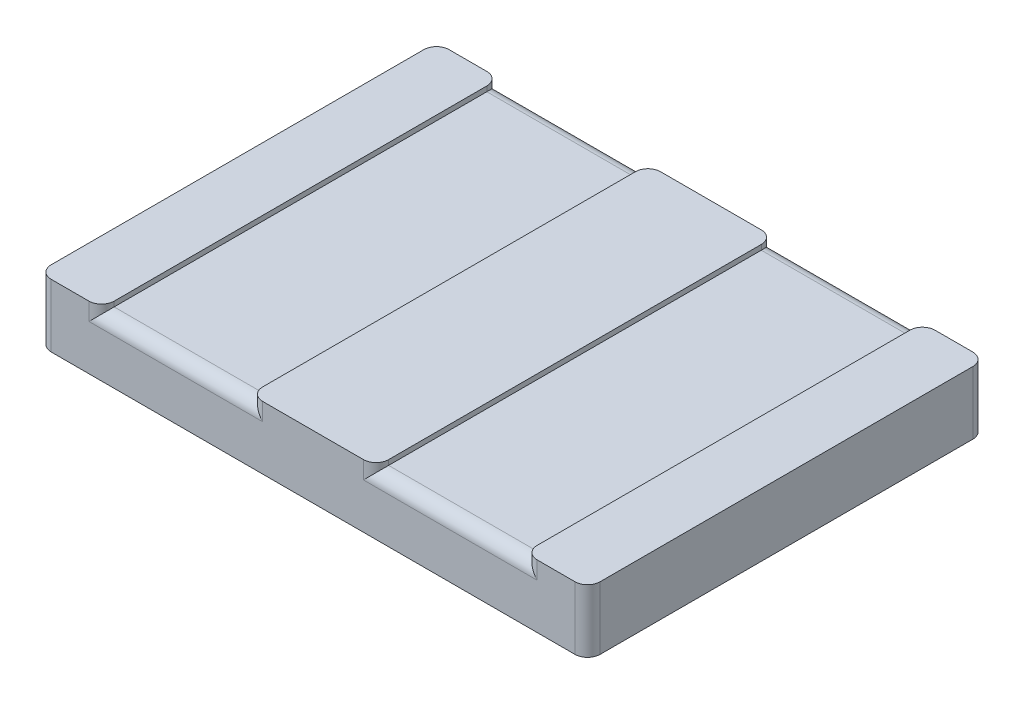
ISO-10303-21;
HEADER;
FILE_DESCRIPTION(('STEP AP214'),'2;1');
FILE_NAME('part.step','',(''),(''),'','','');
FILE_SCHEMA(('AUTOMOTIVE_DESIGN { 1 0 10303 214 1 1 1 1 }'));
ENDSEC;
DATA;
#1=APPLICATION_CONTEXT('core data for automotive mechanical design processes');
#2=APPLICATION_PROTOCOL_DEFINITION('international standard','automotive_design',2000,#1);
#3=PRODUCT_CONTEXT('',#1,'mechanical');
#4=PRODUCT('Part','Part','',(#3));
#5=PRODUCT_RELATED_PRODUCT_CATEGORY('part','',(#4));
#6=PRODUCT_DEFINITION_FORMATION('','',#4);
#7=PRODUCT_DEFINITION_CONTEXT('part definition',#1,'design');
#8=PRODUCT_DEFINITION('design','',#6,#7);
#9=PRODUCT_DEFINITION_SHAPE('','',#8);
#10=(LENGTH_UNIT() NAMED_UNIT(*) SI_UNIT(.MILLI.,.METRE.));
#11=(NAMED_UNIT(*) PLANE_ANGLE_UNIT() SI_UNIT($,.RADIAN.));
#12=(NAMED_UNIT(*) SI_UNIT($,.STERADIAN.) SOLID_ANGLE_UNIT());
#13=UNCERTAINTY_MEASURE_WITH_UNIT(LENGTH_MEASURE(1.E-05),#10,'distance_accuracy_value','');
#14=(GEOMETRIC_REPRESENTATION_CONTEXT(3) GLOBAL_UNCERTAINTY_ASSIGNED_CONTEXT((#13)) GLOBAL_UNIT_ASSIGNED_CONTEXT((#10,
#11,#12)) REPRESENTATION_CONTEXT('',''));
#15=CARTESIAN_POINT('',(0.,0.,0.));
#16=DIRECTION('',(0.,0.,1.));
#17=DIRECTION('',(1.,0.,0.));
#18=AXIS2_PLACEMENT_3D('',#15,#16,#17);
#19=CARTESIAN_POINT('',(10.9,0.,-7.9));
#20=DIRECTION('',(1.,0.,0.));
#21=DIRECTION('',(0.,0.,-1.));
#22=AXIS2_PLACEMENT_3D('',#19,#20,#21);
#23=PLANE('',#22);
#24=DIRECTION('',(0.,0.,1.));
#25=VECTOR('',#24,1.);
#26=CARTESIAN_POINT('',(10.9,0.,-7.9));
#27=LINE('',#26,#25);
#28=CARTESIAN_POINT('',(10.9,0.,-7.4));
#29=VERTEX_POINT('',#28);
#30=CARTESIAN_POINT('',(10.9,0.,7.4));
#31=VERTEX_POINT('',#30);
#32=EDGE_CURVE('E282',#29,#31,#27,.T.);
#33=ORIENTED_EDGE('',*,*,#32,.F.);
#34=DIRECTION('',(0.,1.,0.));
#35=VECTOR('',#34,1.);
#36=CARTESIAN_POINT('',(10.9,2.5,-7.4));
#37=LINE('',#36,#35);
#38=CARTESIAN_POINT('',(10.9,2.5,-7.4));
#39=VERTEX_POINT('',#38);
#40=EDGE_CURVE('E389',#29,#39,#37,.T.);
#41=ORIENTED_EDGE('',*,*,#40,.T.);
#42=DIRECTION('',(0.,0.,1.));
#43=VECTOR('',#42,1.);
#44=CARTESIAN_POINT('',(10.9,2.5,-7.9));
#45=LINE('',#44,#43);
#46=CARTESIAN_POINT('',(10.9,2.5,7.4));
#47=VERTEX_POINT('',#46);
#48=EDGE_CURVE('E276',#39,#47,#45,.T.);
#49=ORIENTED_EDGE('',*,*,#48,.T.);
#50=DIRECTION('',(0.,1.,0.));
#51=VECTOR('',#50,1.);
#52=CARTESIAN_POINT('',(10.9,0.,7.4));
#53=LINE('',#52,#51);
#54=EDGE_CURVE('E386',#47,#31,#53,.F.);
#55=ORIENTED_EDGE('',*,*,#54,.T.);
#56=EDGE_LOOP('',(#33,#41,#49,#55));
#57=FACE_BOUND('',#56,.T.);
#58=ADVANCED_FACE('F39',(#57),#23,.T.);
#59=CARTESIAN_POINT('',(-10.9,0.,-7.9));
#60=DIRECTION('',(0.,-1.,0.));
#61=DIRECTION('',(0.,0.,-1.));
#62=AXIS2_PLACEMENT_3D('',#59,#60,#61);
#63=PLANE('',#62);
#64=DIRECTION('',(0.,0.,1.));
#65=VECTOR('',#64,1.);
#66=CARTESIAN_POINT('',(-10.9,0.,-7.9));
#67=LINE('',#66,#65);
#68=CARTESIAN_POINT('',(-10.9,0.,-7.4));
#69=VERTEX_POINT('',#68);
#70=CARTESIAN_POINT('',(-10.9,0.,7.4));
#71=VERTEX_POINT('',#70);
#72=EDGE_CURVE('E484',#69,#71,#67,.T.);
#73=ORIENTED_EDGE('',*,*,#72,.F.);
#74=CARTESIAN_POINT('',(-10.4,0.,-7.4));
#75=DIRECTION('',(0.,-1.,0.));
#76=DIRECTION('',(0.,0.,-1.));
#77=AXIS2_PLACEMENT_3D('',#74,#75,#76);
#78=CIRCLE('',#77,0.5);
#79=CARTESIAN_POINT('',(-10.4,0.,-7.9));
#80=VERTEX_POINT('',#79);
#81=EDGE_CURVE('E352',#69,#80,#78,.T.);
#82=ORIENTED_EDGE('',*,*,#81,.T.);
#83=DIRECTION('',(1.,0.,0.));
#84=VECTOR('',#83,1.);
#85=CARTESIAN_POINT('',(-10.9,0.,-7.9));
#86=LINE('',#85,#84);
#87=CARTESIAN_POINT('',(10.4,0.,-7.9));
#88=VERTEX_POINT('',#87);
#89=EDGE_CURVE('E280',#80,#88,#86,.T.);
#90=ORIENTED_EDGE('',*,*,#89,.T.);
#91=CARTESIAN_POINT('',(10.4,0.,-7.4));
#92=DIRECTION('',(0.,-1.,0.));
#93=DIRECTION('',(0.,0.,-1.));
#94=AXIS2_PLACEMENT_3D('',#91,#92,#93);
#95=CIRCLE('',#94,0.5);
#96=EDGE_CURVE('E349',#88,#29,#95,.T.);
#97=ORIENTED_EDGE('',*,*,#96,.T.);
#98=ORIENTED_EDGE('',*,*,#32,.T.);
#99=CARTESIAN_POINT('',(10.4,0.,7.4));
#100=DIRECTION('',(0.,-1.,0.));
#101=DIRECTION('',(0.,0.,-1.));
#102=AXIS2_PLACEMENT_3D('',#99,#100,#101);
#103=CIRCLE('',#102,0.5);
#104=CARTESIAN_POINT('',(10.4,0.,7.9));
#105=VERTEX_POINT('',#104);
#106=EDGE_CURVE('E346',#31,#105,#103,.T.);
#107=ORIENTED_EDGE('',*,*,#106,.T.);
#108=DIRECTION('',(1.,0.,0.));
#109=VECTOR('',#108,1.);
#110=CARTESIAN_POINT('',(-10.9,0.,7.9));
#111=LINE('',#110,#109);
#112=CARTESIAN_POINT('',(-10.4,0.,7.9));
#113=VERTEX_POINT('',#112);
#114=EDGE_CURVE('E456',#113,#105,#111,.T.);
#115=ORIENTED_EDGE('',*,*,#114,.F.);
#116=CARTESIAN_POINT('',(-10.4,0.,7.4));
#117=DIRECTION('',(0.,-1.,0.));
#118=DIRECTION('',(0.,0.,-1.));
#119=AXIS2_PLACEMENT_3D('',#116,#117,#118);
#120=CIRCLE('',#119,0.5);
#121=EDGE_CURVE('E343',#113,#71,#120,.T.);
#122=ORIENTED_EDGE('',*,*,#121,.T.);
#123=EDGE_LOOP('',(#73,#82,#90,#97,#98,#107,#115,#122));
#124=FACE_BOUND('',#123,.T.);
#125=ADVANCED_FACE('F498',(#124),#63,.T.);
#126=CARTESIAN_POINT('',(-10.9,0.,-7.9));
#127=DIRECTION('',(-1.,0.,0.));
#128=DIRECTION('',(0.,0.,1.));
#129=AXIS2_PLACEMENT_3D('',#126,#127,#128);
#130=PLANE('',#129);
#131=DIRECTION('',(0.,0.,1.));
#132=VECTOR('',#131,1.);
#133=CARTESIAN_POINT('',(-10.9,2.5,-7.9));
#134=LINE('',#133,#132);
#135=CARTESIAN_POINT('',(-10.9,2.5,-7.4));
#136=VERTEX_POINT('',#135);
#137=CARTESIAN_POINT('',(-10.9,2.5,7.4));
#138=VERTEX_POINT('',#137);
#139=EDGE_CURVE('E251',#136,#138,#134,.T.);
#140=ORIENTED_EDGE('',*,*,#139,.F.);
#141=DIRECTION('',(0.,-1.,0.));
#142=VECTOR('',#141,1.);
#143=CARTESIAN_POINT('',(-10.9,0.,-7.4));
#144=LINE('',#143,#142);
#145=EDGE_CURVE('E339',#136,#69,#144,.T.);
#146=ORIENTED_EDGE('',*,*,#145,.T.);
#147=ORIENTED_EDGE('',*,*,#72,.T.);
#148=DIRECTION('',(0.,-1.,0.));
#149=VECTOR('',#148,1.);
#150=CARTESIAN_POINT('',(-10.9,0.,7.4));
#151=LINE('',#150,#149);
#152=EDGE_CURVE('E336',#71,#138,#151,.F.);
#153=ORIENTED_EDGE('',*,*,#152,.T.);
#154=EDGE_LOOP('',(#140,#146,#147,#153));
#155=FACE_BOUND('',#154,.T.);
#156=ADVANCED_FACE('F576',(#155),#130,.T.);
#157=CARTESIAN_POINT('',(-10.9,2.5,-7.9));
#158=DIRECTION('',(0.,1.,0.));
#159=DIRECTION('',(-1.,0.,0.));
#160=AXIS2_PLACEMENT_3D('',#157,#158,#159);
#161=PLANE('',#160);
#162=DIRECTION('',(0.,0.,1.));
#163=VECTOR('',#162,1.);
#164=CARTESIAN_POINT('',(-8.4,2.5,-7.9));
#165=LINE('',#164,#163);
#166=CARTESIAN_POINT('',(-8.4,2.5,-7.4));
#167=VERTEX_POINT('',#166);
#168=CARTESIAN_POINT('',(-8.4,2.5,7.4));
#169=VERTEX_POINT('',#168);
#170=EDGE_CURVE('E247',#167,#169,#165,.T.);
#171=ORIENTED_EDGE('',*,*,#170,.F.);
#172=CARTESIAN_POINT('',(-8.9,2.5,-7.4));
#173=DIRECTION('',(0.,1.,0.));
#174=DIRECTION('',(-1.,0.,0.));
#175=AXIS2_PLACEMENT_3D('',#172,#173,#174);
#176=CIRCLE('',#175,0.5);
#177=CARTESIAN_POINT('',(-8.9,2.5,-7.9));
#178=VERTEX_POINT('',#177);
#179=EDGE_CURVE('E222',#167,#178,#176,.T.);
#180=ORIENTED_EDGE('',*,*,#179,.T.);
#181=DIRECTION('',(-1.,0.,0.));
#182=VECTOR('',#181,1.);
#183=CARTESIAN_POINT('',(-10.9,2.5,-7.9));
#184=LINE('',#183,#182);
#185=CARTESIAN_POINT('',(-10.4,2.5,-7.9));
#186=VERTEX_POINT('',#185);
#187=EDGE_CURVE('E474',#178,#186,#184,.T.);
#188=ORIENTED_EDGE('',*,*,#187,.T.);
#189=CARTESIAN_POINT('',(-10.4,2.5,-7.4));
#190=DIRECTION('',(0.,1.,0.));
#191=DIRECTION('',(-1.,0.,0.));
#192=AXIS2_PLACEMENT_3D('',#189,#190,#191);
#193=CIRCLE('',#192,0.5);
#194=EDGE_CURVE('E331',#186,#136,#193,.T.);
#195=ORIENTED_EDGE('',*,*,#194,.T.);
#196=ORIENTED_EDGE('',*,*,#139,.T.);
#197=CARTESIAN_POINT('',(-10.4,2.5,7.4));
#198=DIRECTION('',(0.,1.,0.));
#199=DIRECTION('',(-1.,0.,0.));
#200=AXIS2_PLACEMENT_3D('',#197,#198,#199);
#201=CIRCLE('',#200,0.5);
#202=CARTESIAN_POINT('',(-10.4,2.5,7.9));
#203=VERTEX_POINT('',#202);
#204=EDGE_CURVE('E228',#138,#203,#201,.T.);
#205=ORIENTED_EDGE('',*,*,#204,.T.);
#206=DIRECTION('',(-1.,0.,0.));
#207=VECTOR('',#206,1.);
#208=CARTESIAN_POINT('',(-10.9,2.5,7.9));
#209=LINE('',#208,#207);
#210=CARTESIAN_POINT('',(-8.9,2.5,7.9));
#211=VERTEX_POINT('',#210);
#212=EDGE_CURVE('E449',#211,#203,#209,.T.);
#213=ORIENTED_EDGE('',*,*,#212,.F.);
#214=CARTESIAN_POINT('',(-8.9,2.5,7.4));
#215=DIRECTION('',(0.,1.,0.));
#216=DIRECTION('',(-1.,0.,0.));
#217=AXIS2_PLACEMENT_3D('',#214,#215,#216);
#218=CIRCLE('',#217,0.5);
#219=EDGE_CURVE('E328',#211,#169,#218,.T.);
#220=ORIENTED_EDGE('',*,*,#219,.T.);
#221=EDGE_LOOP('',(#171,#180,#188,#195,#196,#205,#213,#220));
#222=FACE_BOUND('',#221,.T.);
#223=ADVANCED_FACE('F452',(#222),#161,.T.);
#224=CARTESIAN_POINT('',(-8.4,2.5,-7.9));
#225=DIRECTION('',(1.,0.,0.));
#226=DIRECTION('',(0.,0.,-1.));
#227=AXIS2_PLACEMENT_3D('',#224,#225,#226);
#228=PLANE('',#227);
#229=DIRECTION('',(0.,0.,1.));
#230=VECTOR('',#229,1.);
#231=CARTESIAN_POINT('',(-8.4,2.29999999999999,-7.9));
#232=LINE('',#231,#230);
#233=CARTESIAN_POINT('',(-8.4,2.29999999999999,-7.4));
#234=VERTEX_POINT('',#233);
#235=CARTESIAN_POINT('',(-8.4,2.29999999999999,7.4));
#236=VERTEX_POINT('',#235);
#237=EDGE_CURVE('E235',#234,#236,#232,.T.);
#238=ORIENTED_EDGE('',*,*,#237,.F.);
#239=DIRECTION('',(0.,1.,0.));
#240=VECTOR('',#239,1.);
#241=CARTESIAN_POINT('',(-8.4,2.5,-7.4));
#242=LINE('',#241,#240);
#243=EDGE_CURVE('E220',#234,#167,#242,.T.);
#244=ORIENTED_EDGE('',*,*,#243,.T.);
#245=ORIENTED_EDGE('',*,*,#170,.T.);
#246=DIRECTION('',(0.,1.,0.));
#247=VECTOR('',#246,1.);
#248=CARTESIAN_POINT('',(-8.4,2.5,7.4));
#249=LINE('',#248,#247);
#250=EDGE_CURVE('E229',#169,#236,#249,.F.);
#251=ORIENTED_EDGE('',*,*,#250,.T.);
#252=EDGE_LOOP('',(#238,#244,#245,#251));
#253=FACE_BOUND('',#252,.T.);
#254=ADVANCED_FACE('F244',(#253),#228,.T.);
#255=CARTESIAN_POINT('',(-8.4,2.29999999999999,-7.9));
#256=DIRECTION('',(0.,1.,0.));
#257=DIRECTION('',(-1.,0.,0.));
#258=AXIS2_PLACEMENT_3D('',#255,#256,#257);
#259=PLANE('',#258);
#260=DIRECTION('',(0.,0.,1.));
#261=VECTOR('',#260,1.);
#262=CARTESIAN_POINT('',(-2.5,2.3,-7.9));
#263=LINE('',#262,#261);
#264=CARTESIAN_POINT('',(-2.5,2.3,-7.4));
#265=VERTEX_POINT('',#264);
#266=CARTESIAN_POINT('',(-2.5,2.3,7.4));
#267=VERTEX_POINT('',#266);
#268=EDGE_CURVE('E238',#265,#267,#263,.T.);
#269=ORIENTED_EDGE('',*,*,#268,.F.);
#270=DIRECTION('',(-1.,0.,0.));
#271=VECTOR('',#270,1.);
#272=CARTESIAN_POINT('',(-8.4,2.29999999999999,-7.4));
#273=LINE('',#272,#271);
#274=EDGE_CURVE('E211',#265,#234,#273,.T.);
#275=ORIENTED_EDGE('',*,*,#274,.T.);
#276=ORIENTED_EDGE('',*,*,#237,.T.);
#277=DIRECTION('',(-1.,0.,0.));
#278=VECTOR('',#277,1.);
#279=CARTESIAN_POINT('',(-8.4,2.29999999999999,7.4));
#280=LINE('',#279,#278);
#281=EDGE_CURVE('E242',#236,#267,#280,.F.);
#282=ORIENTED_EDGE('',*,*,#281,.T.);
#283=EDGE_LOOP('',(#269,#275,#276,#282));
#284=FACE_BOUND('',#283,.T.);
#285=ADVANCED_FACE('F234',(#284),#259,.T.);
#286=CARTESIAN_POINT('',(-2.5,2.3,-7.9));
#287=DIRECTION('',(-1.,0.,0.));
#288=DIRECTION('',(0.,0.,1.));
#289=AXIS2_PLACEMENT_3D('',#286,#287,#288);
#290=PLANE('',#289);
#291=DIRECTION('',(0.,0.,1.));
#292=VECTOR('',#291,1.);
#293=CARTESIAN_POINT('',(-2.5,2.5,-7.9));
#294=LINE('',#293,#292);
#295=CARTESIAN_POINT('',(-2.5,2.5,-7.4));
#296=VERTEX_POINT('',#295);
#297=CARTESIAN_POINT('',(-2.5,2.5,7.4));
#298=VERTEX_POINT('',#297);
#299=EDGE_CURVE('E253',#296,#298,#294,.T.);
#300=ORIENTED_EDGE('',*,*,#299,.F.);
#301=DIRECTION('',(0.,-1.,0.));
#302=VECTOR('',#301,1.);
#303=CARTESIAN_POINT('',(-2.5,2.3,-7.4));
#304=LINE('',#303,#302);
#305=EDGE_CURVE('E309',#296,#265,#304,.T.);
#306=ORIENTED_EDGE('',*,*,#305,.T.);
#307=ORIENTED_EDGE('',*,*,#268,.T.);
#308=DIRECTION('',(0.,-1.,0.));
#309=VECTOR('',#308,1.);
#310=CARTESIAN_POINT('',(-2.5,2.3,7.4));
#311=LINE('',#310,#309);
#312=EDGE_CURVE('E306',#267,#298,#311,.F.);
#313=ORIENTED_EDGE('',*,*,#312,.T.);
#314=EDGE_LOOP('',(#300,#306,#307,#313));
#315=FACE_BOUND('',#314,.T.);
#316=ADVANCED_FACE('F530',(#315),#290,.T.);
#317=CARTESIAN_POINT('',(2.5,2.5,-7.9));
#318=DIRECTION('',(0.,1.,0.));
#319=DIRECTION('',(-1.,0.,0.));
#320=AXIS2_PLACEMENT_3D('',#317,#318,#319);
#321=PLANE('',#320);
#322=DIRECTION('',(-1.,0.,0.));
#323=VECTOR('',#322,1.);
#324=CARTESIAN_POINT('',(2.5,2.5,-7.9));
#325=LINE('',#324,#323);
#326=CARTESIAN_POINT('',(2.,2.5,-7.9));
#327=VERTEX_POINT('',#326);
#328=CARTESIAN_POINT('',(-2.,2.5,-7.9));
#329=VERTEX_POINT('',#328);
#330=EDGE_CURVE('E470',#327,#329,#325,.T.);
#331=ORIENTED_EDGE('',*,*,#330,.T.);
#332=CARTESIAN_POINT('',(-2.,2.5,-7.4));
#333=DIRECTION('',(0.,1.,0.));
#334=DIRECTION('',(-1.,0.,0.));
#335=AXIS2_PLACEMENT_3D('',#332,#333,#334);
#336=CIRCLE('',#335,0.5);
#337=EDGE_CURVE('E321',#329,#296,#336,.T.);
#338=ORIENTED_EDGE('',*,*,#337,.T.);
#339=ORIENTED_EDGE('',*,*,#299,.T.);
#340=CARTESIAN_POINT('',(-2.,2.5,7.4));
#341=DIRECTION('',(0.,1.,0.));
#342=DIRECTION('',(-1.,0.,0.));
#343=AXIS2_PLACEMENT_3D('',#340,#341,#342);
#344=CIRCLE('',#343,0.5);
#345=CARTESIAN_POINT('',(-2.,2.5,7.9));
#346=VERTEX_POINT('',#345);
#347=EDGE_CURVE('E312',#298,#346,#344,.T.);
#348=ORIENTED_EDGE('',*,*,#347,.T.);
#349=DIRECTION('',(-1.,0.,0.));
#350=VECTOR('',#349,1.);
#351=CARTESIAN_POINT('',(2.5,2.5,7.9));
#352=LINE('',#351,#350);
#353=CARTESIAN_POINT('',(2.,2.5,7.9));
#354=VERTEX_POINT('',#353);
#355=EDGE_CURVE('E457',#354,#346,#352,.T.);
#356=ORIENTED_EDGE('',*,*,#355,.F.);
#357=CARTESIAN_POINT('',(2.,2.5,7.4));
#358=DIRECTION('',(0.,1.,0.));
#359=DIRECTION('',(-1.,0.,0.));
#360=AXIS2_PLACEMENT_3D('',#357,#358,#359);
#361=CIRCLE('',#360,0.5);
#362=CARTESIAN_POINT('',(2.5,2.5,7.4));
#363=VERTEX_POINT('',#362);
#364=EDGE_CURVE('E315',#354,#363,#361,.T.);
#365=ORIENTED_EDGE('',*,*,#364,.T.);
#366=DIRECTION('',(0.,0.,1.));
#367=VECTOR('',#366,1.);
#368=CARTESIAN_POINT('',(2.5,2.5,-7.9));
#369=LINE('',#368,#367);
#370=CARTESIAN_POINT('',(2.5,2.5,-7.4));
#371=VERTEX_POINT('',#370);
#372=EDGE_CURVE('E260',#371,#363,#369,.T.);
#373=ORIENTED_EDGE('',*,*,#372,.F.);
#374=CARTESIAN_POINT('',(2.,2.5,-7.4));
#375=DIRECTION('',(0.,1.,0.));
#376=DIRECTION('',(-1.,0.,0.));
#377=AXIS2_PLACEMENT_3D('',#374,#375,#376);
#378=CIRCLE('',#377,0.5);
#379=EDGE_CURVE('E318',#371,#327,#378,.T.);
#380=ORIENTED_EDGE('',*,*,#379,.T.);
#381=EDGE_LOOP('',(#331,#338,#339,#348,#356,#365,#373,#380));
#382=FACE_BOUND('',#381,.T.);
#383=ADVANCED_FACE('F524',(#382),#321,.T.);
#384=CARTESIAN_POINT('',(2.5,2.3,-7.9));
#385=DIRECTION('',(1.,0.,0.));
#386=DIRECTION('',(0.,0.,-1.));
#387=AXIS2_PLACEMENT_3D('',#384,#385,#386);
#388=PLANE('',#387);
#389=DIRECTION('',(0.,0.,1.));
#390=VECTOR('',#389,1.);
#391=CARTESIAN_POINT('',(2.5,2.3,-7.9));
#392=LINE('',#391,#390);
#393=CARTESIAN_POINT('',(2.5,2.3,-7.4));
#394=VERTEX_POINT('',#393);
#395=CARTESIAN_POINT('',(2.5,2.3,7.4));
#396=VERTEX_POINT('',#395);
#397=EDGE_CURVE('E264',#394,#396,#392,.T.);
#398=ORIENTED_EDGE('',*,*,#397,.F.);
#399=DIRECTION('',(0.,1.,0.));
#400=VECTOR('',#399,1.);
#401=CARTESIAN_POINT('',(2.5,2.5,-7.4));
#402=LINE('',#401,#400);
#403=EDGE_CURVE('E358',#394,#371,#402,.T.);
#404=ORIENTED_EDGE('',*,*,#403,.T.);
#405=ORIENTED_EDGE('',*,*,#372,.T.);
#406=DIRECTION('',(0.,1.,0.));
#407=VECTOR('',#406,1.);
#408=CARTESIAN_POINT('',(2.5,2.3,7.4));
#409=LINE('',#408,#407);
#410=EDGE_CURVE('E355',#363,#396,#409,.F.);
#411=ORIENTED_EDGE('',*,*,#410,.T.);
#412=EDGE_LOOP('',(#398,#404,#405,#411));
#413=FACE_BOUND('',#412,.T.);
#414=ADVANCED_FACE('F545',(#413),#388,.T.);
#415=CARTESIAN_POINT('',(8.4,2.3,-7.9));
#416=DIRECTION('',(0.,1.,0.));
#417=DIRECTION('',(-1.,0.,0.));
#418=AXIS2_PLACEMENT_3D('',#415,#416,#417);
#419=PLANE('',#418);
#420=DIRECTION('',(0.,0.,1.));
#421=VECTOR('',#420,1.);
#422=CARTESIAN_POINT('',(8.4,2.3,-7.9));
#423=LINE('',#422,#421);
#424=CARTESIAN_POINT('',(8.4,2.3,-7.4));
#425=VERTEX_POINT('',#424);
#426=CARTESIAN_POINT('',(8.4,2.3,7.4));
#427=VERTEX_POINT('',#426);
#428=EDGE_CURVE('E268',#425,#427,#423,.T.);
#429=ORIENTED_EDGE('',*,*,#428,.F.);
#430=DIRECTION('',(-1.,0.,0.));
#431=VECTOR('',#430,1.);
#432=CARTESIAN_POINT('',(2.5,2.3,-7.4));
#433=LINE('',#432,#431);
#434=EDGE_CURVE('E365',#425,#394,#433,.T.);
#435=ORIENTED_EDGE('',*,*,#434,.T.);
#436=ORIENTED_EDGE('',*,*,#397,.T.);
#437=DIRECTION('',(-1.,0.,0.));
#438=VECTOR('',#437,1.);
#439=CARTESIAN_POINT('',(8.4,2.3,7.4));
#440=LINE('',#439,#438);
#441=EDGE_CURVE('E362',#396,#427,#440,.F.);
#442=ORIENTED_EDGE('',*,*,#441,.T.);
#443=EDGE_LOOP('',(#429,#435,#436,#442));
#444=FACE_BOUND('',#443,.T.);
#445=ADVANCED_FACE('F561',(#444),#419,.T.);
#446=CARTESIAN_POINT('',(8.4,2.5,-7.9));
#447=DIRECTION('',(-1.,0.,0.));
#448=DIRECTION('',(0.,0.,1.));
#449=AXIS2_PLACEMENT_3D('',#446,#447,#448);
#450=PLANE('',#449);
#451=DIRECTION('',(0.,0.,1.));
#452=VECTOR('',#451,1.);
#453=CARTESIAN_POINT('',(8.4,2.5,-7.9));
#454=LINE('',#453,#452);
#455=CARTESIAN_POINT('',(8.4,2.5,-7.4));
#456=VERTEX_POINT('',#455);
#457=CARTESIAN_POINT('',(8.4,2.5,7.4));
#458=VERTEX_POINT('',#457);
#459=EDGE_CURVE('E272',#456,#458,#454,.T.);
#460=ORIENTED_EDGE('',*,*,#459,.F.);
#461=DIRECTION('',(0.,-1.,0.));
#462=VECTOR('',#461,1.);
#463=CARTESIAN_POINT('',(8.4,2.3,-7.4));
#464=LINE('',#463,#462);
#465=EDGE_CURVE('E371',#456,#425,#464,.T.);
#466=ORIENTED_EDGE('',*,*,#465,.T.);
#467=ORIENTED_EDGE('',*,*,#428,.T.);
#468=DIRECTION('',(0.,-1.,0.));
#469=VECTOR('',#468,1.);
#470=CARTESIAN_POINT('',(8.4,2.5,7.4));
#471=LINE('',#470,#469);
#472=EDGE_CURVE('E368',#427,#458,#471,.F.);
#473=ORIENTED_EDGE('',*,*,#472,.T.);
#474=EDGE_LOOP('',(#460,#466,#467,#473));
#475=FACE_BOUND('',#474,.T.);
#476=ADVANCED_FACE('F559',(#475),#450,.T.);
#477=CARTESIAN_POINT('',(10.9,2.5,-7.9));
#478=DIRECTION('',(0.,1.,0.));
#479=DIRECTION('',(-1.,0.,0.));
#480=AXIS2_PLACEMENT_3D('',#477,#478,#479);
#481=PLANE('',#480);
#482=DIRECTION('',(-1.,0.,0.));
#483=VECTOR('',#482,1.);
#484=CARTESIAN_POINT('',(10.9,2.5,-7.9));
#485=LINE('',#484,#483);
#486=CARTESIAN_POINT('',(10.4,2.5,-7.9));
#487=VERTEX_POINT('',#486);
#488=CARTESIAN_POINT('',(8.90000000000001,2.5,-7.9));
#489=VERTEX_POINT('',#488);
#490=EDGE_CURVE('E461',#487,#489,#485,.T.);
#491=ORIENTED_EDGE('',*,*,#490,.T.);
#492=CARTESIAN_POINT('',(8.9,2.5,-7.4));
#493=DIRECTION('',(0.,1.,0.));
#494=DIRECTION('',(-1.,0.,0.));
#495=AXIS2_PLACEMENT_3D('',#492,#493,#494);
#496=CIRCLE('',#495,0.5);
#497=EDGE_CURVE('E383',#489,#456,#496,.T.);
#498=ORIENTED_EDGE('',*,*,#497,.T.);
#499=ORIENTED_EDGE('',*,*,#459,.T.);
#500=CARTESIAN_POINT('',(8.9,2.5,7.4));
#501=DIRECTION('',(0.,1.,0.));
#502=DIRECTION('',(-1.,0.,0.));
#503=AXIS2_PLACEMENT_3D('',#500,#501,#502);
#504=CIRCLE('',#503,0.5);
#505=CARTESIAN_POINT('',(8.90000000000001,2.5,7.9));
#506=VERTEX_POINT('',#505);
#507=EDGE_CURVE('E374',#458,#506,#504,.T.);
#508=ORIENTED_EDGE('',*,*,#507,.T.);
#509=DIRECTION('',(-1.,0.,0.));
#510=VECTOR('',#509,1.);
#511=CARTESIAN_POINT('',(10.9,2.5,7.9));
#512=LINE('',#511,#510);
#513=CARTESIAN_POINT('',(10.4,2.5,7.9));
#514=VERTEX_POINT('',#513);
#515=EDGE_CURVE('E416',#514,#506,#512,.T.);
#516=ORIENTED_EDGE('',*,*,#515,.F.);
#517=CARTESIAN_POINT('',(10.4,2.5,7.4));
#518=DIRECTION('',(0.,1.,0.));
#519=DIRECTION('',(-1.,0.,0.));
#520=AXIS2_PLACEMENT_3D('',#517,#518,#519);
#521=CIRCLE('',#520,0.5);
#522=EDGE_CURVE('E377',#514,#47,#521,.T.);
#523=ORIENTED_EDGE('',*,*,#522,.T.);
#524=ORIENTED_EDGE('',*,*,#48,.F.);
#525=CARTESIAN_POINT('',(10.4,2.5,-7.4));
#526=DIRECTION('',(0.,1.,0.));
#527=DIRECTION('',(-1.,0.,0.));
#528=AXIS2_PLACEMENT_3D('',#525,#526,#527);
#529=CIRCLE('',#528,0.5);
#530=EDGE_CURVE('E380',#39,#487,#529,.T.);
#531=ORIENTED_EDGE('',*,*,#530,.T.);
#532=EDGE_LOOP('',(#491,#498,#499,#508,#516,#523,#524,#531));
#533=FACE_BOUND('',#532,.T.);
#534=ADVANCED_FACE('F507',(#533),#481,.T.);
#535=CARTESIAN_POINT('',(0.,0.,-7.9));
#536=DIRECTION('',(0.,0.,1.));
#537=DIRECTION('',(1.,0.,0.));
#538=AXIS2_PLACEMENT_3D('',#535,#536,#537);
#539=PLANE('',#538);
#540=DIRECTION('',(-1.,0.,0.));
#541=VECTOR('',#540,1.);
#542=CARTESIAN_POINT('',(-2.5,1.8,-7.9));
#543=LINE('',#542,#541);
#544=CARTESIAN_POINT('',(-8.9,1.79999999999999,-7.9));
#545=VERTEX_POINT('',#544);
#546=CARTESIAN_POINT('',(-2.,1.8,-7.9));
#547=VERTEX_POINT('',#546);
#548=EDGE_CURVE('E212',#545,#547,#543,.F.);
#549=ORIENTED_EDGE('',*,*,#548,.T.);
#550=DIRECTION('',(0.,-1.,0.));
#551=VECTOR('',#550,1.);
#552=CARTESIAN_POINT('',(-2.,2.5,-7.9));
#553=LINE('',#552,#551);
#554=EDGE_CURVE('E303',#547,#329,#553,.F.);
#555=ORIENTED_EDGE('',*,*,#554,.T.);
#556=ORIENTED_EDGE('',*,*,#330,.F.);
#557=DIRECTION('',(0.,1.,0.));
#558=VECTOR('',#557,1.);
#559=CARTESIAN_POINT('',(2.,2.3,-7.9));
#560=LINE('',#559,#558);
#561=CARTESIAN_POINT('',(2.,1.8,-7.9));
#562=VERTEX_POINT('',#561);
#563=EDGE_CURVE('E292',#327,#562,#560,.F.);
#564=ORIENTED_EDGE('',*,*,#563,.T.);
#565=DIRECTION('',(-1.,0.,0.));
#566=VECTOR('',#565,1.);
#567=CARTESIAN_POINT('',(8.4,1.8,-7.9));
#568=LINE('',#567,#566);
#569=CARTESIAN_POINT('',(8.9,1.8,-7.9));
#570=VERTEX_POINT('',#569);
#571=EDGE_CURVE('E289',#562,#570,#568,.F.);
#572=ORIENTED_EDGE('',*,*,#571,.T.);
#573=DIRECTION('',(0.,-1.,0.));
#574=VECTOR('',#573,1.);
#575=CARTESIAN_POINT('',(8.9,2.5,-7.9));
#576=LINE('',#575,#574);
#577=EDGE_CURVE('E286',#570,#489,#576,.F.);
#578=ORIENTED_EDGE('',*,*,#577,.T.);
#579=ORIENTED_EDGE('',*,*,#490,.F.);
#580=DIRECTION('',(0.,1.,0.));
#581=VECTOR('',#580,1.);
#582=CARTESIAN_POINT('',(10.4,0.,-7.9));
#583=LINE('',#582,#581);
#584=EDGE_CURVE('E241',#487,#88,#583,.F.);
#585=ORIENTED_EDGE('',*,*,#584,.T.);
#586=ORIENTED_EDGE('',*,*,#89,.F.);
#587=DIRECTION('',(0.,-1.,0.));
#588=VECTOR('',#587,1.);
#589=CARTESIAN_POINT('',(-10.4,2.5,-7.9));
#590=LINE('',#589,#588);
#591=EDGE_CURVE('E295',#80,#186,#590,.F.);
#592=ORIENTED_EDGE('',*,*,#591,.T.);
#593=ORIENTED_EDGE('',*,*,#187,.F.);
#594=DIRECTION('',(0.,1.,0.));
#595=VECTOR('',#594,1.);
#596=CARTESIAN_POINT('',(-8.9,2.29999999999999,-7.9));
#597=LINE('',#596,#595);
#598=EDGE_CURVE('E298',#178,#545,#597,.F.);
#599=ORIENTED_EDGE('',*,*,#598,.T.);
#600=EDGE_LOOP('',(#549,#555,#556,#564,#572,#578,#579,#585,#586,#592,#593,#599));
#601=FACE_BOUND('',#600,.T.);
#602=ADVANCED_FACE('F538',(#601),#539,.F.);
#603=CARTESIAN_POINT('',(0.,0.,7.9));
#604=DIRECTION('',(0.,0.,1.));
#605=DIRECTION('',(1.,0.,0.));
#606=AXIS2_PLACEMENT_3D('',#603,#604,#605);
#607=PLANE('',#606);
#608=ORIENTED_EDGE('',*,*,#114,.T.);
#609=DIRECTION('',(0.,1.,0.));
#610=VECTOR('',#609,1.);
#611=CARTESIAN_POINT('',(10.4,0.,7.9));
#612=LINE('',#611,#610);
#613=EDGE_CURVE('E11',#105,#514,#612,.T.);
#614=ORIENTED_EDGE('',*,*,#613,.T.);
#615=ORIENTED_EDGE('',*,*,#515,.T.);
#616=DIRECTION('',(0.,-1.,0.));
#617=VECTOR('',#616,1.);
#618=CARTESIAN_POINT('',(8.9,0.,7.9));
#619=LINE('',#618,#617);
#620=CARTESIAN_POINT('',(8.9,1.8,7.9));
#621=VERTEX_POINT('',#620);
#622=EDGE_CURVE('E49',#506,#621,#619,.T.);
#623=ORIENTED_EDGE('',*,*,#622,.T.);
#624=DIRECTION('',(-1.,0.,0.));
#625=VECTOR('',#624,1.);
#626=CARTESIAN_POINT('',(0.,1.8,7.9));
#627=LINE('',#626,#625);
#628=CARTESIAN_POINT('',(2.,1.8,7.9));
#629=VERTEX_POINT('',#628);
#630=EDGE_CURVE('E64',#621,#629,#627,.T.);
#631=ORIENTED_EDGE('',*,*,#630,.T.);
#632=DIRECTION('',(0.,1.,0.));
#633=VECTOR('',#632,1.);
#634=CARTESIAN_POINT('',(2.,0.,7.9));
#635=LINE('',#634,#633);
#636=EDGE_CURVE('E407',#629,#354,#635,.T.);
#637=ORIENTED_EDGE('',*,*,#636,.T.);
#638=ORIENTED_EDGE('',*,*,#355,.T.);
#639=DIRECTION('',(0.,-1.,0.));
#640=VECTOR('',#639,1.);
#641=CARTESIAN_POINT('',(-2.,0.,7.9));
#642=LINE('',#641,#640);
#643=CARTESIAN_POINT('',(-2.,1.8,7.9));
#644=VERTEX_POINT('',#643);
#645=EDGE_CURVE('E403',#346,#644,#642,.T.);
#646=ORIENTED_EDGE('',*,*,#645,.T.);
#647=DIRECTION('',(-1.,0.,0.));
#648=VECTOR('',#647,1.);
#649=CARTESIAN_POINT('',(0.,1.8,7.9));
#650=LINE('',#649,#648);
#651=CARTESIAN_POINT('',(-8.9,1.79999999999999,7.9));
#652=VERTEX_POINT('',#651);
#653=EDGE_CURVE('E400',#644,#652,#650,.T.);
#654=ORIENTED_EDGE('',*,*,#653,.T.);
#655=DIRECTION('',(0.,1.,0.));
#656=VECTOR('',#655,1.);
#657=CARTESIAN_POINT('',(-8.9,0.,7.9));
#658=LINE('',#657,#656);
#659=EDGE_CURVE('E397',#652,#211,#658,.T.);
#660=ORIENTED_EDGE('',*,*,#659,.T.);
#661=ORIENTED_EDGE('',*,*,#212,.T.);
#662=DIRECTION('',(0.,-1.,0.));
#663=VECTOR('',#662,1.);
#664=CARTESIAN_POINT('',(-10.4,0.,7.9));
#665=LINE('',#664,#663);
#666=EDGE_CURVE('E393',#203,#113,#665,.T.);
#667=ORIENTED_EDGE('',*,*,#666,.T.);
#668=EDGE_LOOP('',(#608,#614,#615,#623,#631,#637,#638,#646,#654,#660,#661,#667));
#669=FACE_BOUND('',#668,.T.);
#670=ADVANCED_FACE('F448',(#669),#607,.T.);
#671=CARTESIAN_POINT('',(-2.,2.3,-7.4));
#672=DIRECTION('',(0.,1.,0.));
#673=DIRECTION('',(0.,0.,1.));
#674=AXIS2_PLACEMENT_3D('',#671,#672,#673);
#675=CYLINDRICAL_SURFACE('',#674,0.5);
#676=ORIENTED_EDGE('',*,*,#337,.F.);
#677=ORIENTED_EDGE('',*,*,#554,.F.);
#678=CARTESIAN_POINT('',(-2.,1.8,-7.4));
#679=DIRECTION('',(0.707106781186547,0.707106781186548,0.));
#680=DIRECTION('',(0.707106781186548,-0.707106781186547,0.));
#681=AXIS2_PLACEMENT_3D('',#678,#679,#680);
#682=ELLIPSE('',#681,0.707106781186547,0.5);
#683=EDGE_CURVE('E216',#265,#547,#682,.F.);
#684=ORIENTED_EDGE('',*,*,#683,.F.);
#685=ORIENTED_EDGE('',*,*,#305,.F.);
#686=EDGE_LOOP('',(#676,#677,#684,#685));
#687=FACE_BOUND('',#686,.T.);
#688=ADVANCED_FACE('F534',(#687),#675,.T.);
#689=CARTESIAN_POINT('',(-8.9,2.5,-7.4));
#690=DIRECTION('',(0.,-1.,0.));
#691=DIRECTION('',(0.,0.,-1.));
#692=AXIS2_PLACEMENT_3D('',#689,#690,#691);
#693=CYLINDRICAL_SURFACE('',#692,0.5);
#694=ORIENTED_EDGE('',*,*,#179,.F.);
#695=ORIENTED_EDGE('',*,*,#243,.F.);
#696=CARTESIAN_POINT('',(-8.9,1.79999999999999,-7.4));
#697=DIRECTION('',(0.707106781186548,-0.707106781186547,0.));
#698=DIRECTION('',(0.707106781186547,0.707106781186548,0.));
#699=AXIS2_PLACEMENT_3D('',#696,#697,#698);
#700=ELLIPSE('',#699,0.707106781186548,0.5);
#701=EDGE_CURVE('E206',#545,#234,#700,.T.);
#702=ORIENTED_EDGE('',*,*,#701,.F.);
#703=ORIENTED_EDGE('',*,*,#598,.F.);
#704=EDGE_LOOP('',(#694,#695,#702,#703));
#705=FACE_BOUND('',#704,.T.);
#706=ADVANCED_FACE('F221',(#705),#693,.T.);
#707=CARTESIAN_POINT('',(-8.4,1.79999999999999,-7.4));
#708=DIRECTION('',(1.,0.,0.));
#709=DIRECTION('',(0.,1.,0.));
#710=AXIS2_PLACEMENT_3D('',#707,#708,#709);
#711=CYLINDRICAL_SURFACE('',#710,0.5);
#712=ORIENTED_EDGE('',*,*,#683,.T.);
#713=ORIENTED_EDGE('',*,*,#548,.F.);
#714=ORIENTED_EDGE('',*,*,#701,.T.);
#715=ORIENTED_EDGE('',*,*,#274,.F.);
#716=EDGE_LOOP('',(#712,#713,#714,#715));
#717=FACE_BOUND('',#716,.T.);
#718=ADVANCED_FACE('F209',(#717),#711,.T.);
#719=CARTESIAN_POINT('',(-10.4,0.,-7.4));
#720=DIRECTION('',(0.,1.,0.));
#721=DIRECTION('',(0.,0.,1.));
#722=AXIS2_PLACEMENT_3D('',#719,#720,#721);
#723=CYLINDRICAL_SURFACE('',#722,0.5);
#724=ORIENTED_EDGE('',*,*,#194,.F.);
#725=ORIENTED_EDGE('',*,*,#591,.F.);
#726=ORIENTED_EDGE('',*,*,#81,.F.);
#727=ORIENTED_EDGE('',*,*,#145,.F.);
#728=EDGE_LOOP('',(#724,#725,#726,#727));
#729=FACE_BOUND('',#728,.T.);
#730=ADVANCED_FACE('F582',(#729),#723,.T.);
#731=CARTESIAN_POINT('',(8.9,2.5,-7.4));
#732=DIRECTION('',(0.,1.,0.));
#733=DIRECTION('',(0.,0.,1.));
#734=AXIS2_PLACEMENT_3D('',#731,#732,#733);
#735=CYLINDRICAL_SURFACE('',#734,0.5);
#736=ORIENTED_EDGE('',*,*,#497,.F.);
#737=ORIENTED_EDGE('',*,*,#577,.F.);
#738=CARTESIAN_POINT('',(8.9,1.8,-7.4));
#739=DIRECTION('',(0.707106781186547,0.707106781186548,0.));
#740=DIRECTION('',(0.707106781186548,-0.707106781186547,0.));
#741=AXIS2_PLACEMENT_3D('',#738,#739,#740);
#742=ELLIPSE('',#741,0.707106781186547,0.5);
#743=EDGE_CURVE('E217',#425,#570,#742,.F.);
#744=ORIENTED_EDGE('',*,*,#743,.F.);
#745=ORIENTED_EDGE('',*,*,#465,.F.);
#746=EDGE_LOOP('',(#736,#737,#744,#745));
#747=FACE_BOUND('',#746,.T.);
#748=ADVANCED_FACE('F557',(#747),#735,.T.);
#749=CARTESIAN_POINT('',(8.4,1.8,-7.4));
#750=DIRECTION('',(1.,0.,0.));
#751=DIRECTION('',(0.,1.,0.));
#752=AXIS2_PLACEMENT_3D('',#749,#750,#751);
#753=CYLINDRICAL_SURFACE('',#752,0.5);
#754=ORIENTED_EDGE('',*,*,#743,.T.);
#755=ORIENTED_EDGE('',*,*,#571,.F.);
#756=CARTESIAN_POINT('',(2.,1.8,-7.4));
#757=DIRECTION('',(0.707106781186548,-0.707106781186547,0.));
#758=DIRECTION('',(-0.707106781186547,-0.707106781186548,0.));
#759=AXIS2_PLACEMENT_3D('',#756,#757,#758);
#760=ELLIPSE('',#759,0.707106781186548,0.5);
#761=EDGE_CURVE('E417',#394,#562,#760,.F.);
#762=ORIENTED_EDGE('',*,*,#761,.F.);
#763=ORIENTED_EDGE('',*,*,#434,.F.);
#764=EDGE_LOOP('',(#754,#755,#762,#763));
#765=FACE_BOUND('',#764,.T.);
#766=ADVANCED_FACE('F551',(#765),#753,.T.);
#767=CARTESIAN_POINT('',(2.,2.3,-7.4));
#768=DIRECTION('',(0.,-1.,0.));
#769=DIRECTION('',(0.,0.,-1.));
#770=AXIS2_PLACEMENT_3D('',#767,#768,#769);
#771=CYLINDRICAL_SURFACE('',#770,0.5);
#772=ORIENTED_EDGE('',*,*,#761,.T.);
#773=ORIENTED_EDGE('',*,*,#563,.F.);
#774=ORIENTED_EDGE('',*,*,#379,.F.);
#775=ORIENTED_EDGE('',*,*,#403,.F.);
#776=EDGE_LOOP('',(#772,#773,#774,#775));
#777=FACE_BOUND('',#776,.T.);
#778=ADVANCED_FACE('F542',(#777),#771,.T.);
#779=CARTESIAN_POINT('',(10.4,0.,-7.4));
#780=DIRECTION('',(0.,-1.,0.));
#781=DIRECTION('',(0.,0.,-1.));
#782=AXIS2_PLACEMENT_3D('',#779,#780,#781);
#783=CYLINDRICAL_SURFACE('',#782,0.5);
#784=ORIENTED_EDGE('',*,*,#96,.F.);
#785=ORIENTED_EDGE('',*,*,#584,.F.);
#786=ORIENTED_EDGE('',*,*,#530,.F.);
#787=ORIENTED_EDGE('',*,*,#40,.F.);
#788=EDGE_LOOP('',(#784,#785,#786,#787));
#789=FACE_BOUND('',#788,.T.);
#790=ADVANCED_FACE('F592',(#789),#783,.T.);
#791=CARTESIAN_POINT('',(10.4,0.,7.4));
#792=DIRECTION('',(0.,1.,0.));
#793=DIRECTION('',(0.,0.,1.));
#794=AXIS2_PLACEMENT_3D('',#791,#792,#793);
#795=CYLINDRICAL_SURFACE('',#794,0.5);
#796=ORIENTED_EDGE('',*,*,#106,.F.);
#797=ORIENTED_EDGE('',*,*,#54,.F.);
#798=ORIENTED_EDGE('',*,*,#522,.F.);
#799=ORIENTED_EDGE('',*,*,#613,.F.);
#800=EDGE_LOOP('',(#796,#797,#798,#799));
#801=FACE_BOUND('',#800,.T.);
#802=ADVANCED_FACE('F503',(#801),#795,.T.);
#803=CARTESIAN_POINT('',(2.,0.,7.4));
#804=DIRECTION('',(0.,1.,0.));
#805=DIRECTION('',(0.,0.,1.));
#806=AXIS2_PLACEMENT_3D('',#803,#804,#805);
#807=CYLINDRICAL_SURFACE('',#806,0.5);
#808=ORIENTED_EDGE('',*,*,#364,.F.);
#809=ORIENTED_EDGE('',*,*,#636,.F.);
#810=CARTESIAN_POINT('',(2.,1.8,7.4));
#811=DIRECTION('',(-0.707106781186548,0.707106781186547,0.));
#812=DIRECTION('',(-0.707106781186547,-0.707106781186548,0.));
#813=AXIS2_PLACEMENT_3D('',#810,#811,#812);
#814=ELLIPSE('',#813,0.707106781186548,0.5);
#815=EDGE_CURVE('E421',#396,#629,#814,.F.);
#816=ORIENTED_EDGE('',*,*,#815,.F.);
#817=ORIENTED_EDGE('',*,*,#410,.F.);
#818=EDGE_LOOP('',(#808,#809,#816,#817));
#819=FACE_BOUND('',#818,.T.);
#820=ADVANCED_FACE('F521',(#819),#807,.T.);
#821=CARTESIAN_POINT('',(0.,1.8,7.4));
#822=DIRECTION('',(-1.,0.,0.));
#823=DIRECTION('',(0.,-1.,0.));
#824=AXIS2_PLACEMENT_3D('',#821,#822,#823);
#825=CYLINDRICAL_SURFACE('',#824,0.5);
#826=ORIENTED_EDGE('',*,*,#815,.T.);
#827=ORIENTED_EDGE('',*,*,#630,.F.);
#828=CARTESIAN_POINT('',(8.9,1.8,7.4));
#829=DIRECTION('',(-0.707106781186547,-0.707106781186548,0.));
#830=DIRECTION('',(0.707106781186548,-0.707106781186547,0.));
#831=AXIS2_PLACEMENT_3D('',#828,#829,#830);
#832=ELLIPSE('',#831,0.707106781186547,0.5);
#833=EDGE_CURVE('E57',#427,#621,#832,.F.);
#834=ORIENTED_EDGE('',*,*,#833,.F.);
#835=ORIENTED_EDGE('',*,*,#441,.F.);
#836=EDGE_LOOP('',(#826,#827,#834,#835));
#837=FACE_BOUND('',#836,.T.);
#838=ADVANCED_FACE('F516',(#837),#825,.T.);
#839=CARTESIAN_POINT('',(8.9,0.,7.4));
#840=DIRECTION('',(0.,-1.,0.));
#841=DIRECTION('',(0.,0.,-1.));
#842=AXIS2_PLACEMENT_3D('',#839,#840,#841);
#843=CYLINDRICAL_SURFACE('',#842,0.5);
#844=ORIENTED_EDGE('',*,*,#507,.F.);
#845=ORIENTED_EDGE('',*,*,#472,.F.);
#846=ORIENTED_EDGE('',*,*,#833,.T.);
#847=ORIENTED_EDGE('',*,*,#622,.F.);
#848=EDGE_LOOP('',(#844,#845,#846,#847));
#849=FACE_BOUND('',#848,.T.);
#850=ADVANCED_FACE('F512',(#849),#843,.T.);
#851=CARTESIAN_POINT('',(-8.9,0.,7.4));
#852=DIRECTION('',(0.,1.,0.));
#853=DIRECTION('',(0.,0.,1.));
#854=AXIS2_PLACEMENT_3D('',#851,#852,#853);
#855=CYLINDRICAL_SURFACE('',#854,0.5);
#856=ORIENTED_EDGE('',*,*,#219,.F.);
#857=ORIENTED_EDGE('',*,*,#659,.F.);
#858=CARTESIAN_POINT('',(-8.9,1.79999999999999,7.4));
#859=DIRECTION('',(-0.707106781186548,0.707106781186547,0.));
#860=DIRECTION('',(-0.707106781186547,-0.707106781186548,0.));
#861=AXIS2_PLACEMENT_3D('',#858,#859,#860);
#862=ELLIPSE('',#861,0.707106781186548,0.5);
#863=EDGE_CURVE('E43',#236,#652,#862,.F.);
#864=ORIENTED_EDGE('',*,*,#863,.F.);
#865=ORIENTED_EDGE('',*,*,#250,.F.);
#866=EDGE_LOOP('',(#856,#857,#864,#865));
#867=FACE_BOUND('',#866,.T.);
#868=ADVANCED_FACE('F444',(#867),#855,.T.);
#869=CARTESIAN_POINT('',(0.,1.8,7.4));
#870=DIRECTION('',(-1.,0.,0.));
#871=DIRECTION('',(0.,-1.,0.));
#872=AXIS2_PLACEMENT_3D('',#869,#870,#871);
#873=CYLINDRICAL_SURFACE('',#872,0.5);
#874=ORIENTED_EDGE('',*,*,#863,.T.);
#875=ORIENTED_EDGE('',*,*,#653,.F.);
#876=CARTESIAN_POINT('',(-2.,1.8,7.4));
#877=DIRECTION('',(-0.707106781186547,-0.707106781186548,0.));
#878=DIRECTION('',(0.707106781186548,-0.707106781186547,0.));
#879=AXIS2_PLACEMENT_3D('',#876,#877,#878);
#880=ELLIPSE('',#879,0.707106781186547,0.5);
#881=EDGE_CURVE('E429',#267,#644,#880,.F.);
#882=ORIENTED_EDGE('',*,*,#881,.F.);
#883=ORIENTED_EDGE('',*,*,#281,.F.);
#884=EDGE_LOOP('',(#874,#875,#882,#883));
#885=FACE_BOUND('',#884,.T.);
#886=ADVANCED_FACE('F440',(#885),#873,.T.);
#887=CARTESIAN_POINT('',(-2.,0.,7.4));
#888=DIRECTION('',(0.,-1.,0.));
#889=DIRECTION('',(0.,0.,-1.));
#890=AXIS2_PLACEMENT_3D('',#887,#888,#889);
#891=CYLINDRICAL_SURFACE('',#890,0.5);
#892=ORIENTED_EDGE('',*,*,#347,.F.);
#893=ORIENTED_EDGE('',*,*,#312,.F.);
#894=ORIENTED_EDGE('',*,*,#881,.T.);
#895=ORIENTED_EDGE('',*,*,#645,.F.);
#896=EDGE_LOOP('',(#892,#893,#894,#895));
#897=FACE_BOUND('',#896,.T.);
#898=ADVANCED_FACE('F528',(#897),#891,.T.);
#899=CARTESIAN_POINT('',(-10.4,0.,7.4));
#900=DIRECTION('',(0.,-1.,0.));
#901=DIRECTION('',(0.,0.,-1.));
#902=AXIS2_PLACEMENT_3D('',#899,#900,#901);
#903=CYLINDRICAL_SURFACE('',#902,0.5);
#904=ORIENTED_EDGE('',*,*,#204,.F.);
#905=ORIENTED_EDGE('',*,*,#152,.F.);
#906=ORIENTED_EDGE('',*,*,#121,.F.);
#907=ORIENTED_EDGE('',*,*,#666,.F.);
#908=EDGE_LOOP('',(#904,#905,#906,#907));
#909=FACE_BOUND('',#908,.T.);
#910=ADVANCED_FACE('F41',(#909),#903,.T.);
#911=CLOSED_SHELL('',(#58,#125,#156,#223,#254,#285,#316,#383,#414,#445,#476,#534,#602,#670,#688,
#706,#718,#730,#748,#766,#778,#790,#802,#820,#838,#850,#868,#886,#898,#910));
#912=MANIFOLD_SOLID_BREP('B2',#911);
#913=ADVANCED_BREP_SHAPE_REPRESENTATION('',(#18,#912),#14);
#914=SHAPE_DEFINITION_REPRESENTATION(#9,#913);
ENDSEC;
END-ISO-10303-21;
